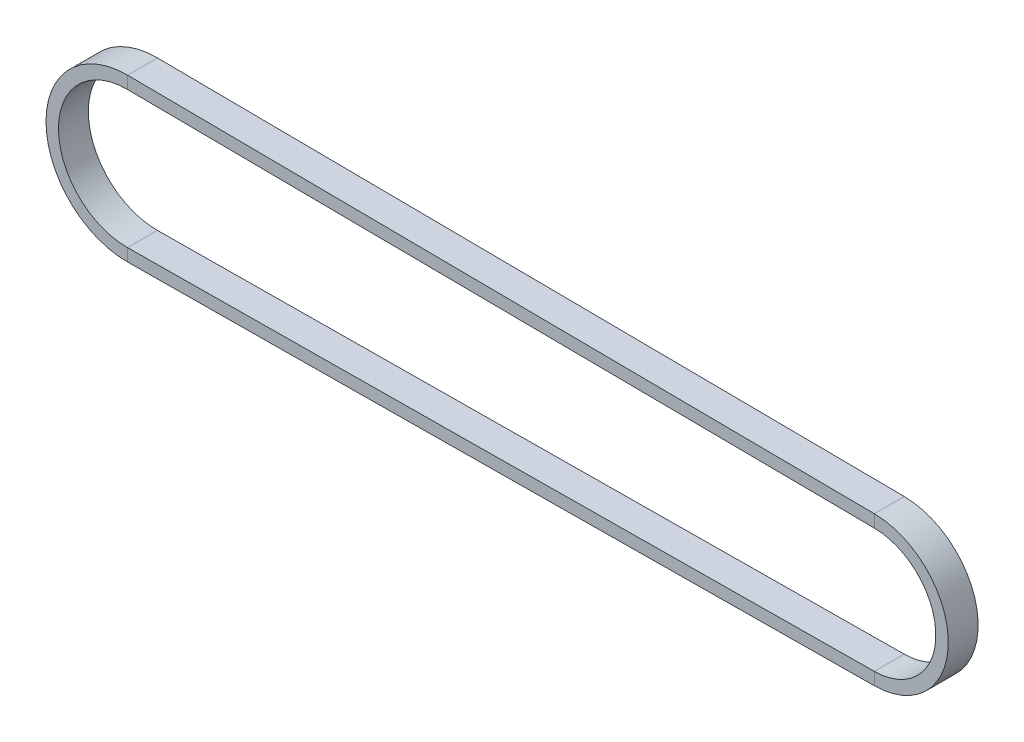
ISO-10303-21;
HEADER;
FILE_DESCRIPTION(('STEP AP214'),'2;1');
FILE_NAME('part.step','',(''),(''),'','','');
FILE_SCHEMA(('AUTOMOTIVE_DESIGN { 1 0 10303 214 1 1 1 1 }'));
ENDSEC;
DATA;
#1=APPLICATION_CONTEXT('core data for automotive mechanical design processes');
#2=APPLICATION_PROTOCOL_DEFINITION('international standard','automotive_design',2000,#1);
#3=PRODUCT_CONTEXT('',#1,'mechanical');
#4=PRODUCT('Part','Part','',(#3));
#5=PRODUCT_RELATED_PRODUCT_CATEGORY('part','',(#4));
#6=PRODUCT_DEFINITION_FORMATION('','',#4);
#7=PRODUCT_DEFINITION_CONTEXT('part definition',#1,'design');
#8=PRODUCT_DEFINITION('design','',#6,#7);
#9=PRODUCT_DEFINITION_SHAPE('','',#8);
#10=(LENGTH_UNIT() NAMED_UNIT(*) SI_UNIT(.MILLI.,.METRE.));
#11=(NAMED_UNIT(*) PLANE_ANGLE_UNIT() SI_UNIT($,.RADIAN.));
#12=(NAMED_UNIT(*) SI_UNIT($,.STERADIAN.) SOLID_ANGLE_UNIT());
#13=UNCERTAINTY_MEASURE_WITH_UNIT(LENGTH_MEASURE(1.E-05),#10,'distance_accuracy_value','');
#14=(GEOMETRIC_REPRESENTATION_CONTEXT(3) GLOBAL_UNCERTAINTY_ASSIGNED_CONTEXT((#13)) GLOBAL_UNIT_ASSIGNED_CONTEXT((#10,
#11,#12)) REPRESENTATION_CONTEXT('',''));
#15=CARTESIAN_POINT('',(0.,0.,0.));
#16=DIRECTION('',(0.,0.,1.));
#17=DIRECTION('',(1.,0.,0.));
#18=AXIS2_PLACEMENT_3D('',#15,#16,#17);
#19=CARTESIAN_POINT('',(-300.,0.,0.));
#20=DIRECTION('',(0.,0.,-1.));
#21=DIRECTION('',(-1.,0.,0.));
#22=AXIS2_PLACEMENT_3D('',#19,#20,#21);
#23=CYLINDRICAL_SURFACE('',#22,27.5);
#24=CARTESIAN_POINT('',(-300.,0.,6.));
#25=DIRECTION('',(0.,0.,-1.));
#26=DIRECTION('',(0.00858166666666675,-0.999963176820638,0.));
#27=AXIS2_PLACEMENT_3D('',#24,#25,#26);
#28=CIRCLE('',#27,27.5);
#29=CARTESIAN_POINT('',(-299.764004166667,-27.4989873625676,6.));
#30=VERTEX_POINT('',#29);
#31=CARTESIAN_POINT('',(-299.764004166667,27.4989873625675,6.));
#32=VERTEX_POINT('',#31);
#33=EDGE_CURVE('E11',#30,#32,#28,.T.);
#34=ORIENTED_EDGE('',*,*,#33,.F.);
#35=DIRECTION('',(0.,0.,-1.));
#36=VECTOR('',#35,1.);
#37=CARTESIAN_POINT('',(-299.764004166667,-27.4989873625676,-6.));
#38=LINE('',#37,#36);
#39=CARTESIAN_POINT('',(-299.764004166667,-27.4989873625676,-6.));
#40=VERTEX_POINT('',#39);
#41=EDGE_CURVE('E46',#30,#40,#38,.T.);
#42=ORIENTED_EDGE('',*,*,#41,.T.);
#43=CARTESIAN_POINT('',(-300.,0.,-6.));
#44=DIRECTION('',(0.,0.,-1.));
#45=DIRECTION('',(0.00858166666666675,-0.999963176820638,0.));
#46=AXIS2_PLACEMENT_3D('',#43,#44,#45);
#47=CIRCLE('',#46,27.5);
#48=CARTESIAN_POINT('',(-299.764004166667,27.4989873625675,-6.));
#49=VERTEX_POINT('',#48);
#50=EDGE_CURVE('E126',#40,#49,#47,.T.);
#51=ORIENTED_EDGE('',*,*,#50,.T.);
#52=DIRECTION('',(0.,0.,-1.));
#53=VECTOR('',#52,1.);
#54=CARTESIAN_POINT('',(-299.764004166667,27.4989873625675,-6.));
#55=LINE('',#54,#53);
#56=EDGE_CURVE('E131',#32,#49,#55,.T.);
#57=ORIENTED_EDGE('',*,*,#56,.F.);
#58=EDGE_LOOP('',(#34,#42,#51,#57));
#59=FACE_BOUND('',#58,.T.);
#60=ADVANCED_FACE('F43',(#59),#23,.F.);
#61=CARTESIAN_POINT('',(-299.764004166667,-27.4989873625676,6.));
#62=DIRECTION('',(0.,0.,1.));
#63=DIRECTION('',(1.,0.,0.));
#64=AXIS2_PLACEMENT_3D('',#61,#62,#63);
#65=PLANE('',#64);
#66=CARTESIAN_POINT('',(-300.,0.,6.));
#67=DIRECTION('',(0.,0.,-1.));
#68=DIRECTION('',(0.00858166666666613,-0.999963176820638,0.));
#69=AXIS2_PLACEMENT_3D('',#66,#67,#68);
#70=CIRCLE('',#69,32.5);
#71=CARTESIAN_POINT('',(-299.721095833333,-32.4988032466707,6.));
#72=VERTEX_POINT('',#71);
#73=CARTESIAN_POINT('',(-299.721095833333,32.4988032466707,6.));
#74=VERTEX_POINT('',#73);
#75=EDGE_CURVE('E51',#72,#74,#70,.T.);
#76=ORIENTED_EDGE('',*,*,#75,.F.);
#77=DIRECTION('',(-0.00858166666667063,0.999963176820638,0.));
#78=VECTOR('',#77,1.);
#79=CARTESIAN_POINT('',(-299.764004166667,-27.4989873625676,6.));
#80=LINE('',#79,#78);
#81=EDGE_CURVE('E200',#72,#30,#80,.T.);
#82=ORIENTED_EDGE('',*,*,#81,.T.);
#83=ORIENTED_EDGE('',*,*,#33,.T.);
#84=DIRECTION('',(-0.00858166666666271,-0.999963176820638,0.));
#85=VECTOR('',#84,1.);
#86=CARTESIAN_POINT('',(-299.764004166667,27.4989873625675,6.));
#87=LINE('',#86,#85);
#88=EDGE_CURVE('E157',#74,#32,#87,.T.);
#89=ORIENTED_EDGE('',*,*,#88,.F.);
#90=EDGE_LOOP('',(#76,#82,#83,#89));
#91=FACE_BOUND('',#90,.T.);
#92=ADVANCED_FACE('F240',(#91),#65,.T.);
#93=CARTESIAN_POINT('',(-300.,0.,0.));
#94=DIRECTION('',(0.,0.,-1.));
#95=DIRECTION('',(-1.,0.,0.));
#96=AXIS2_PLACEMENT_3D('',#93,#94,#95);
#97=CYLINDRICAL_SURFACE('',#96,32.5);
#98=CARTESIAN_POINT('',(-300.,0.,-6.));
#99=DIRECTION('',(0.,0.,-1.));
#100=DIRECTION('',(0.00858166666666613,-0.999963176820638,0.));
#101=AXIS2_PLACEMENT_3D('',#98,#99,#100);
#102=CIRCLE('',#101,32.5);
#103=CARTESIAN_POINT('',(-299.721095833333,-32.4988032466707,-6.));
#104=VERTEX_POINT('',#103);
#105=CARTESIAN_POINT('',(-299.721095833333,32.4988032466707,-6.));
#106=VERTEX_POINT('',#105);
#107=EDGE_CURVE('E140',#104,#106,#102,.T.);
#108=ORIENTED_EDGE('',*,*,#107,.F.);
#109=DIRECTION('',(0.,0.,1.));
#110=VECTOR('',#109,1.);
#111=CARTESIAN_POINT('',(-299.721095833333,-32.4988032466707,-6.));
#112=LINE('',#111,#110);
#113=EDGE_CURVE('E181',#104,#72,#112,.T.);
#114=ORIENTED_EDGE('',*,*,#113,.T.);
#115=ORIENTED_EDGE('',*,*,#75,.T.);
#116=DIRECTION('',(0.,0.,1.));
#117=VECTOR('',#116,1.);
#118=CARTESIAN_POINT('',(-299.721095833333,32.4988032466707,-6.));
#119=LINE('',#118,#117);
#120=EDGE_CURVE('E162',#106,#74,#119,.T.);
#121=ORIENTED_EDGE('',*,*,#120,.F.);
#122=EDGE_LOOP('',(#108,#114,#115,#121));
#123=FACE_BOUND('',#122,.T.);
#124=ADVANCED_FACE('F232',(#123),#97,.T.);
#125=CARTESIAN_POINT('',(0.213902332500016,-24.9245821638428,-6.));
#126=DIRECTION('',(-0.00858166666666671,0.999963176820638,0.));
#127=DIRECTION('',(-0.999963176820638,-0.00858166666666671,0.));
#128=AXIS2_PLACEMENT_3D('',#125,#126,#127);
#129=PLANE('',#128);
#130=ORIENTED_EDGE('',*,*,#41,.F.);
#131=DIRECTION('',(-0.999963176820638,-0.00858166666666671,0.));
#132=VECTOR('',#131,1.);
#133=CARTESIAN_POINT('',(0.213902332500016,-24.9245821638428,6.));
#134=LINE('',#133,#132);
#135=CARTESIAN_POINT('',(0.213902332500015,-24.9245821638428,6.));
#136=VERTEX_POINT('',#135);
#137=EDGE_CURVE('E56',#136,#30,#134,.T.);
#138=ORIENTED_EDGE('',*,*,#137,.F.);
#139=DIRECTION('',(0.,0.,-1.));
#140=VECTOR('',#139,1.);
#141=CARTESIAN_POINT('',(0.213902332500016,-24.9245821638428,-6.));
#142=LINE('',#141,#140);
#143=CARTESIAN_POINT('',(0.213902332500015,-24.9245821638428,-6.));
#144=VERTEX_POINT('',#143);
#145=EDGE_CURVE('E184',#136,#144,#142,.T.);
#146=ORIENTED_EDGE('',*,*,#145,.T.);
#147=DIRECTION('',(-0.999963176820638,-0.00858166666666671,0.));
#148=VECTOR('',#147,1.);
#149=CARTESIAN_POINT('',(0.213902332500016,-24.9245821638428,-6.));
#150=LINE('',#149,#148);
#151=EDGE_CURVE('E183',#144,#40,#150,.T.);
#152=ORIENTED_EDGE('',*,*,#151,.T.);
#153=EDGE_LOOP('',(#130,#138,#146,#152));
#154=FACE_BOUND('',#153,.T.);
#155=ADVANCED_FACE('F212',(#154),#129,.T.);
#156=CARTESIAN_POINT('',(0.213902332500016,-24.9245821638428,6.));
#157=DIRECTION('',(0.,0.,1.));
#158=DIRECTION('',(1.,0.,0.));
#159=AXIS2_PLACEMENT_3D('',#156,#157,#158);
#160=PLANE('',#159);
#161=ORIENTED_EDGE('',*,*,#137,.T.);
#162=ORIENTED_EDGE('',*,*,#81,.F.);
#163=DIRECTION('',(-0.999963176820638,-0.00858166666666671,0.));
#164=VECTOR('',#163,1.);
#165=CARTESIAN_POINT('',(0.256810665833329,-29.924398047946,6.));
#166=LINE('',#165,#164);
#167=CARTESIAN_POINT('',(0.256810665833335,-29.924398047946,6.));
#168=VERTEX_POINT('',#167);
#169=EDGE_CURVE('E66',#168,#72,#166,.T.);
#170=ORIENTED_EDGE('',*,*,#169,.F.);
#171=DIRECTION('',(-0.0085816666666709,0.999963176820638,0.));
#172=VECTOR('',#171,1.);
#173=CARTESIAN_POINT('',(0.213902332500016,-24.9245821638428,6.));
#174=LINE('',#173,#172);
#175=EDGE_CURVE('E191',#168,#136,#174,.T.);
#176=ORIENTED_EDGE('',*,*,#175,.T.);
#177=EDGE_LOOP('',(#161,#162,#170,#176));
#178=FACE_BOUND('',#177,.T.);
#179=ADVANCED_FACE('F223',(#178),#160,.T.);
#180=CARTESIAN_POINT('',(0.256810665833329,-29.924398047946,-6.));
#181=DIRECTION('',(0.00858166666666671,-0.999963176820638,0.));
#182=DIRECTION('',(0.999963176820638,0.00858166666666671,0.));
#183=AXIS2_PLACEMENT_3D('',#180,#181,#182);
#184=PLANE('',#183);
#185=ORIENTED_EDGE('',*,*,#169,.T.);
#186=ORIENTED_EDGE('',*,*,#113,.F.);
#187=DIRECTION('',(-0.999963176820638,-0.00858166666666671,0.));
#188=VECTOR('',#187,1.);
#189=CARTESIAN_POINT('',(0.256810665833329,-29.924398047946,-6.));
#190=LINE('',#189,#188);
#191=CARTESIAN_POINT('',(0.256810665833335,-29.924398047946,-6.));
#192=VERTEX_POINT('',#191);
#193=EDGE_CURVE('E96',#192,#104,#190,.T.);
#194=ORIENTED_EDGE('',*,*,#193,.F.);
#195=DIRECTION('',(0.,0.,1.));
#196=VECTOR('',#195,1.);
#197=CARTESIAN_POINT('',(0.256810665833329,-29.924398047946,-6.));
#198=LINE('',#197,#196);
#199=EDGE_CURVE('E172',#192,#168,#198,.T.);
#200=ORIENTED_EDGE('',*,*,#199,.T.);
#201=EDGE_LOOP('',(#185,#186,#194,#200));
#202=FACE_BOUND('',#201,.T.);
#203=ADVANCED_FACE('F224',(#202),#184,.T.);
#204=CARTESIAN_POINT('',(0.213902332500016,-24.9245821638428,-6.));
#205=DIRECTION('',(0.,0.,-1.));
#206=DIRECTION('',(0.,1.,0.));
#207=AXIS2_PLACEMENT_3D('',#204,#205,#206);
#208=PLANE('',#207);
#209=ORIENTED_EDGE('',*,*,#193,.T.);
#210=DIRECTION('',(0.00858166666667063,-0.999963176820638,0.));
#211=VECTOR('',#210,1.);
#212=CARTESIAN_POINT('',(-299.764004166667,-27.4989873625676,-6.));
#213=LINE('',#212,#211);
#214=EDGE_CURVE('E177',#40,#104,#213,.T.);
#215=ORIENTED_EDGE('',*,*,#214,.F.);
#216=ORIENTED_EDGE('',*,*,#151,.F.);
#217=DIRECTION('',(0.0085816666666709,-0.999963176820638,0.));
#218=VECTOR('',#217,1.);
#219=CARTESIAN_POINT('',(0.213902332500016,-24.9245821638428,-6.));
#220=LINE('',#219,#218);
#221=EDGE_CURVE('E169',#144,#192,#220,.T.);
#222=ORIENTED_EDGE('',*,*,#221,.T.);
#223=EDGE_LOOP('',(#209,#215,#216,#222));
#224=FACE_BOUND('',#223,.T.);
#225=ADVANCED_FACE('F231',(#224),#208,.T.);
#226=CARTESIAN_POINT('',(0.,0.,0.));
#227=DIRECTION('',(0.,0.,-1.));
#228=DIRECTION('',(-1.,0.,0.));
#229=AXIS2_PLACEMENT_3D('',#226,#227,#228);
#230=CYLINDRICAL_SURFACE('',#229,24.9255);
#231=ORIENTED_EDGE('',*,*,#145,.F.);
#232=CARTESIAN_POINT('',(0.,0.,6.));
#233=DIRECTION('',(0.,0.,-1.));
#234=DIRECTION('',(0.0085816666666673,0.999963176820638,0.));
#235=AXIS2_PLACEMENT_3D('',#232,#233,#234);
#236=CIRCLE('',#235,24.9255);
#237=CARTESIAN_POINT('',(0.213902332500127,24.9245821638428,6.));
#238=VERTEX_POINT('',#237);
#239=EDGE_CURVE('E204',#238,#136,#236,.T.);
#240=ORIENTED_EDGE('',*,*,#239,.F.);
#241=DIRECTION('',(0.,0.,-1.));
#242=VECTOR('',#241,1.);
#243=CARTESIAN_POINT('',(0.213902332500071,24.9245821638428,-6.));
#244=LINE('',#243,#242);
#245=CARTESIAN_POINT('',(0.213902332500127,24.9245821638428,-6.));
#246=VERTEX_POINT('',#245);
#247=EDGE_CURVE('E178',#238,#246,#244,.T.);
#248=ORIENTED_EDGE('',*,*,#247,.T.);
#249=CARTESIAN_POINT('',(0.,0.,-6.));
#250=DIRECTION('',(0.,0.,-1.));
#251=DIRECTION('',(0.0085816666666673,0.999963176820638,0.));
#252=AXIS2_PLACEMENT_3D('',#249,#250,#251);
#253=CIRCLE('',#252,24.9255);
#254=EDGE_CURVE('E171',#246,#144,#253,.T.);
#255=ORIENTED_EDGE('',*,*,#254,.T.);
#256=EDGE_LOOP('',(#231,#240,#248,#255));
#257=FACE_BOUND('',#256,.T.);
#258=ADVANCED_FACE('F220',(#257),#230,.F.);
#259=CARTESIAN_POINT('',(0.213902332500016,24.9245821638428,6.));
#260=DIRECTION('',(0.,0.,1.));
#261=DIRECTION('',(1.,0.,0.));
#262=AXIS2_PLACEMENT_3D('',#259,#260,#261);
#263=PLANE('',#262);
#264=ORIENTED_EDGE('',*,*,#239,.T.);
#265=ORIENTED_EDGE('',*,*,#175,.F.);
#266=CARTESIAN_POINT('',(0.,0.,6.));
#267=DIRECTION('',(0.,0.,-1.));
#268=DIRECTION('',(0.00858166666666654,0.999963176820638,0.));
#269=AXIS2_PLACEMENT_3D('',#266,#267,#268);
#270=CIRCLE('',#269,29.9255);
#271=CARTESIAN_POINT('',(0.25681066583344,29.924398047946,6.));
#272=VERTEX_POINT('',#271);
#273=EDGE_CURVE('E109',#272,#168,#270,.T.);
#274=ORIENTED_EDGE('',*,*,#273,.F.);
#275=DIRECTION('',(-0.00858166666666271,-0.999963176820638,0.));
#276=VECTOR('',#275,1.);
#277=CARTESIAN_POINT('',(0.213902332500071,24.9245821638428,6.));
#278=LINE('',#277,#276);
#279=EDGE_CURVE('E192',#272,#238,#278,.T.);
#280=ORIENTED_EDGE('',*,*,#279,.T.);
#281=EDGE_LOOP('',(#264,#265,#274,#280));
#282=FACE_BOUND('',#281,.T.);
#283=ADVANCED_FACE('F225',(#282),#263,.T.);
#284=CARTESIAN_POINT('',(0.,0.,0.));
#285=DIRECTION('',(0.,0.,-1.));
#286=DIRECTION('',(-1.,0.,0.));
#287=AXIS2_PLACEMENT_3D('',#284,#285,#286);
#288=CYLINDRICAL_SURFACE('',#287,29.9255);
#289=ORIENTED_EDGE('',*,*,#273,.T.);
#290=ORIENTED_EDGE('',*,*,#199,.F.);
#291=CARTESIAN_POINT('',(0.,0.,-6.));
#292=DIRECTION('',(0.,0.,-1.));
#293=DIRECTION('',(0.00858166666666654,0.999963176820638,0.));
#294=AXIS2_PLACEMENT_3D('',#291,#292,#293);
#295=CIRCLE('',#294,29.9255);
#296=CARTESIAN_POINT('',(0.25681066583344,29.924398047946,-6.));
#297=VERTEX_POINT('',#296);
#298=EDGE_CURVE('E113',#297,#192,#295,.T.);
#299=ORIENTED_EDGE('',*,*,#298,.F.);
#300=DIRECTION('',(0.,0.,1.));
#301=VECTOR('',#300,1.);
#302=CARTESIAN_POINT('',(0.256810665833385,29.924398047946,-6.));
#303=LINE('',#302,#301);
#304=EDGE_CURVE('E166',#297,#272,#303,.T.);
#305=ORIENTED_EDGE('',*,*,#304,.T.);
#306=EDGE_LOOP('',(#289,#290,#299,#305));
#307=FACE_BOUND('',#306,.T.);
#308=ADVANCED_FACE('F251',(#307),#288,.T.);
#309=CARTESIAN_POINT('',(0.213902332500016,24.9245821638428,-6.));
#310=DIRECTION('',(0.,0.,-1.));
#311=DIRECTION('',(-1.,0.,0.));
#312=AXIS2_PLACEMENT_3D('',#309,#310,#311);
#313=PLANE('',#312);
#314=ORIENTED_EDGE('',*,*,#298,.T.);
#315=ORIENTED_EDGE('',*,*,#221,.F.);
#316=ORIENTED_EDGE('',*,*,#254,.F.);
#317=DIRECTION('',(0.00858166666666271,0.999963176820638,0.));
#318=VECTOR('',#317,1.);
#319=CARTESIAN_POINT('',(0.213902332500071,24.9245821638428,-6.));
#320=LINE('',#319,#318);
#321=EDGE_CURVE('E149',#246,#297,#320,.T.);
#322=ORIENTED_EDGE('',*,*,#321,.T.);
#323=EDGE_LOOP('',(#314,#315,#316,#322));
#324=FACE_BOUND('',#323,.T.);
#325=ADVANCED_FACE('F214',(#324),#313,.T.);
#326=CARTESIAN_POINT('',(-299.764004166667,27.4989873625675,-6.));
#327=DIRECTION('',(-0.00858166666666664,-0.999963176820638,0.));
#328=DIRECTION('',(0.999963176820638,-0.00858166666666664,0.));
#329=AXIS2_PLACEMENT_3D('',#326,#327,#328);
#330=PLANE('',#329);
#331=ORIENTED_EDGE('',*,*,#247,.F.);
#332=DIRECTION('',(0.999963176820638,-0.00858166666666664,0.));
#333=VECTOR('',#332,1.);
#334=CARTESIAN_POINT('',(-299.764004166667,27.4989873625675,6.));
#335=LINE('',#334,#333);
#336=EDGE_CURVE('E151',#32,#238,#335,.T.);
#337=ORIENTED_EDGE('',*,*,#336,.F.);
#338=ORIENTED_EDGE('',*,*,#56,.T.);
#339=DIRECTION('',(0.999963176820638,-0.00858166666666664,0.));
#340=VECTOR('',#339,1.);
#341=CARTESIAN_POINT('',(-299.764004166667,27.4989873625675,-6.));
#342=LINE('',#341,#340);
#343=EDGE_CURVE('E142',#49,#246,#342,.T.);
#344=ORIENTED_EDGE('',*,*,#343,.T.);
#345=EDGE_LOOP('',(#331,#337,#338,#344));
#346=FACE_BOUND('',#345,.T.);
#347=ADVANCED_FACE('F153',(#346),#330,.T.);
#348=CARTESIAN_POINT('',(-299.764004166667,27.4989873625675,6.));
#349=DIRECTION('',(0.,0.,1.));
#350=DIRECTION('',(1.,0.,0.));
#351=AXIS2_PLACEMENT_3D('',#348,#349,#350);
#352=PLANE('',#351);
#353=ORIENTED_EDGE('',*,*,#336,.T.);
#354=ORIENTED_EDGE('',*,*,#279,.F.);
#355=DIRECTION('',(0.999963176820638,-0.00858166666666664,0.));
#356=VECTOR('',#355,1.);
#357=CARTESIAN_POINT('',(-299.721095833333,32.4988032466707,6.));
#358=LINE('',#357,#356);
#359=EDGE_CURVE('E187',#74,#272,#358,.T.);
#360=ORIENTED_EDGE('',*,*,#359,.F.);
#361=ORIENTED_EDGE('',*,*,#88,.T.);
#362=EDGE_LOOP('',(#353,#354,#360,#361));
#363=FACE_BOUND('',#362,.T.);
#364=ADVANCED_FACE('F219',(#363),#352,.T.);
#365=CARTESIAN_POINT('',(-299.721095833333,32.4988032466707,-6.));
#366=DIRECTION('',(0.00858166666666664,0.999963176820638,0.));
#367=DIRECTION('',(-0.999963176820638,0.00858166666666664,0.));
#368=AXIS2_PLACEMENT_3D('',#365,#366,#367);
#369=PLANE('',#368);
#370=ORIENTED_EDGE('',*,*,#359,.T.);
#371=ORIENTED_EDGE('',*,*,#304,.F.);
#372=DIRECTION('',(0.999963176820638,-0.00858166666666664,0.));
#373=VECTOR('',#372,1.);
#374=CARTESIAN_POINT('',(-299.721095833333,32.4988032466707,-6.));
#375=LINE('',#374,#373);
#376=EDGE_CURVE('E167',#106,#297,#375,.T.);
#377=ORIENTED_EDGE('',*,*,#376,.F.);
#378=ORIENTED_EDGE('',*,*,#120,.T.);
#379=EDGE_LOOP('',(#370,#371,#377,#378));
#380=FACE_BOUND('',#379,.T.);
#381=ADVANCED_FACE('F264',(#380),#369,.T.);
#382=CARTESIAN_POINT('',(-299.764004166667,27.4989873625675,-6.));
#383=DIRECTION('',(0.,0.,-1.));
#384=DIRECTION('',(0.,1.,0.));
#385=AXIS2_PLACEMENT_3D('',#382,#383,#384);
#386=PLANE('',#385);
#387=ORIENTED_EDGE('',*,*,#376,.T.);
#388=ORIENTED_EDGE('',*,*,#321,.F.);
#389=ORIENTED_EDGE('',*,*,#343,.F.);
#390=DIRECTION('',(0.00858166666666271,0.999963176820638,0.));
#391=VECTOR('',#390,1.);
#392=CARTESIAN_POINT('',(-299.764004166667,27.4989873625675,-6.));
#393=LINE('',#392,#391);
#394=EDGE_CURVE('E147',#49,#106,#393,.T.);
#395=ORIENTED_EDGE('',*,*,#394,.T.);
#396=EDGE_LOOP('',(#387,#388,#389,#395));
#397=FACE_BOUND('',#396,.T.);
#398=ADVANCED_FACE('F144',(#397),#386,.T.);
#399=CARTESIAN_POINT('',(-299.764004166667,-27.4989873625676,-6.));
#400=DIRECTION('',(0.,0.,-1.));
#401=DIRECTION('',(-1.,0.,0.));
#402=AXIS2_PLACEMENT_3D('',#399,#400,#401);
#403=PLANE('',#402);
#404=ORIENTED_EDGE('',*,*,#214,.T.);
#405=ORIENTED_EDGE('',*,*,#107,.T.);
#406=ORIENTED_EDGE('',*,*,#394,.F.);
#407=ORIENTED_EDGE('',*,*,#50,.F.);
#408=EDGE_LOOP('',(#404,#405,#406,#407));
#409=FACE_BOUND('',#408,.T.);
#410=ADVANCED_FACE('F156',(#409),#403,.T.);
#411=CLOSED_SHELL('',(#60,#92,#124,#155,#179,#203,#225,#258,#283,#308,#325,#347,#364,#381,#398,#410));
#412=MANIFOLD_SOLID_BREP('B2',#411);
#413=ADVANCED_BREP_SHAPE_REPRESENTATION('',(#18,#412),#14);
#414=SHAPE_DEFINITION_REPRESENTATION(#9,#413);
ENDSEC;
END-ISO-10303-21;
